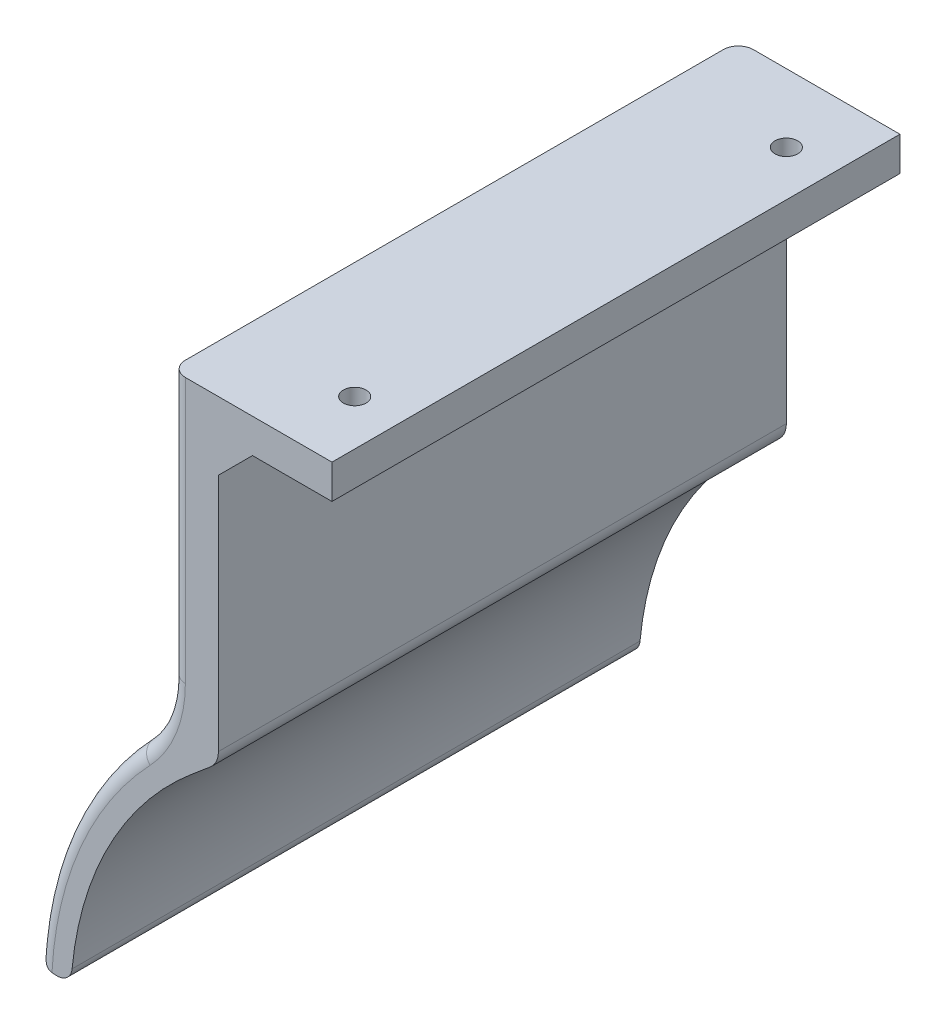
ISO-10303-21;
HEADER;
FILE_DESCRIPTION(('STEP AP214'),'2;1');
FILE_NAME('part.step','',(''),(''),'','','');
FILE_SCHEMA(('AUTOMOTIVE_DESIGN { 1 0 10303 214 1 1 1 1 }'));
ENDSEC;
DATA;
#1=APPLICATION_CONTEXT('core data for automotive mechanical design processes');
#2=APPLICATION_PROTOCOL_DEFINITION('international standard','automotive_design',2000,#1);
#3=PRODUCT_CONTEXT('',#1,'mechanical');
#4=PRODUCT('Part','Part','',(#3));
#5=PRODUCT_RELATED_PRODUCT_CATEGORY('part','',(#4));
#6=PRODUCT_DEFINITION_FORMATION('','',#4);
#7=PRODUCT_DEFINITION_CONTEXT('part definition',#1,'design');
#8=PRODUCT_DEFINITION('design','',#6,#7);
#9=PRODUCT_DEFINITION_SHAPE('','',#8);
#10=(LENGTH_UNIT() NAMED_UNIT(*) SI_UNIT(.MILLI.,.METRE.));
#11=(NAMED_UNIT(*) PLANE_ANGLE_UNIT() SI_UNIT($,.RADIAN.));
#12=(NAMED_UNIT(*) SI_UNIT($,.STERADIAN.) SOLID_ANGLE_UNIT());
#13=UNCERTAINTY_MEASURE_WITH_UNIT(LENGTH_MEASURE(1.E-05),#10,'distance_accuracy_value','');
#14=(GEOMETRIC_REPRESENTATION_CONTEXT(3) GLOBAL_UNCERTAINTY_ASSIGNED_CONTEXT((#13)) GLOBAL_UNIT_ASSIGNED_CONTEXT((#10,
#11,#12)) REPRESENTATION_CONTEXT('',''));
#15=CARTESIAN_POINT('',(0.,0.,0.));
#16=DIRECTION('',(0.,0.,1.));
#17=DIRECTION('',(1.,0.,0.));
#18=AXIS2_PLACEMENT_3D('',#15,#16,#17);
#19=CARTESIAN_POINT('',(-71.3019102651285,49.909696122629,25.));
#20=DIRECTION('',(0.,-1.,0.));
#21=DIRECTION('',(1.,0.,0.));
#22=AXIS2_PLACEMENT_3D('',#19,#20,#21);
#23=PLANE('',#22);
#24=CARTESIAN_POINT('',(-10.9854949612392,49.909696122629,-19.));
#25=DIRECTION('',(0.,-1.,0.));
#26=DIRECTION('',(1.,0.,0.));
#27=AXIS2_PLACEMENT_3D('',#24,#25,#26);
#28=CIRCLE('',#27,1.);
#29=CARTESIAN_POINT('',(-9.98549496123919,49.909696122629,-19.));
#30=VERTEX_POINT('',#29);
#31=EDGE_CURVE('E195',#30,#30,#28,.T.);
#32=ORIENTED_EDGE('',*,*,#31,.F.);
#33=EDGE_LOOP('',(#32));
#34=FACE_BOUND('',#33,.T.);
#35=CARTESIAN_POINT('',(-10.9854949612392,49.909696122629,19.));
#36=DIRECTION('',(0.,-1.,0.));
#37=DIRECTION('',(-1.,0.,0.));
#38=AXIS2_PLACEMENT_3D('',#35,#36,#37);
#39=CIRCLE('',#38,1.);
#40=CARTESIAN_POINT('',(-11.9854949612392,49.909696122629,19.));
#41=VERTEX_POINT('',#40);
#42=EDGE_CURVE('E442',#41,#41,#39,.T.);
#43=ORIENTED_EDGE('',*,*,#42,.F.);
#44=EDGE_LOOP('',(#43));
#45=FACE_BOUND('',#44,.T.);
#46=DIRECTION('',(1.,0.,0.));
#47=VECTOR('',#46,1.);
#48=CARTESIAN_POINT('',(-71.3019102651285,49.909696122629,25.));
#49=LINE('',#48,#47);
#50=CARTESIAN_POINT('',(-13.9854949612392,49.909696122629,25.));
#51=VERTEX_POINT('',#50);
#52=CARTESIAN_POINT('',(-6.98549496123919,49.909696122629,25.));
#53=VERTEX_POINT('',#52);
#54=EDGE_CURVE('E171',#51,#53,#49,.T.);
#55=ORIENTED_EDGE('',*,*,#54,.F.);
#56=DIRECTION('',(0.,0.,-1.));
#57=VECTOR('',#56,1.);
#58=CARTESIAN_POINT('',(-13.9854949612392,49.909696122629,25.));
#59=LINE('',#58,#57);
#60=CARTESIAN_POINT('',(-13.9854949612392,49.909696122629,-25.));
#61=VERTEX_POINT('',#60);
#62=EDGE_CURVE('E71',#51,#61,#59,.T.);
#63=ORIENTED_EDGE('',*,*,#62,.T.);
#64=DIRECTION('',(1.,0.,0.));
#65=VECTOR('',#64,1.);
#66=CARTESIAN_POINT('',(-71.3019102651285,49.909696122629,-25.));
#67=LINE('',#66,#65);
#68=CARTESIAN_POINT('',(-6.98549496123919,49.909696122629,-25.));
#69=VERTEX_POINT('',#68);
#70=EDGE_CURVE('E179',#61,#69,#67,.T.);
#71=ORIENTED_EDGE('',*,*,#70,.T.);
#72=DIRECTION('',(0.,0.,-1.));
#73=VECTOR('',#72,1.);
#74=CARTESIAN_POINT('',(-6.98549496123919,49.909696122629,25.));
#75=LINE('',#74,#73);
#76=EDGE_CURVE('E182',#53,#69,#75,.T.);
#77=ORIENTED_EDGE('',*,*,#76,.F.);
#78=EDGE_LOOP('',(#55,#63,#71,#77));
#79=FACE_BOUND('',#78,.T.);
#80=ADVANCED_FACE('F49',(#34,#45,#79),#23,.T.);
#81=CARTESIAN_POINT('',(-18.9854949612392,25.842311438939,25.));
#82=DIRECTION('',(0.,0.,-1.));
#83=DIRECTION('',(-1.,0.,0.));
#84=AXIS2_PLACEMENT_3D('',#81,#82,#83);
#85=CYLINDRICAL_SURFACE('',#84,2.);
#86=DIRECTION('',(0.,0.,-1.));
#87=VECTOR('',#86,1.);
#88=CARTESIAN_POINT('',(-16.9854949612392,25.842311438939,25.));
#89=LINE('',#88,#87);
#90=CARTESIAN_POINT('',(-16.9854949612392,25.842311438939,25.));
#91=VERTEX_POINT('',#90);
#92=CARTESIAN_POINT('',(-16.9854949612392,25.842311438939,-25.));
#93=VERTEX_POINT('',#92);
#94=EDGE_CURVE('E238',#91,#93,#89,.T.);
#95=ORIENTED_EDGE('',*,*,#94,.F.);
#96=CARTESIAN_POINT('',(-18.9854949612392,25.842311438939,25.));
#97=DIRECTION('',(0.,0.,1.));
#98=DIRECTION('',(1.,0.,0.));
#99=AXIS2_PLACEMENT_3D('',#96,#97,#98);
#100=CIRCLE('',#99,2.);
#101=CARTESIAN_POINT('',(-17.6999197418661,24.310222552701,25.));
#102=VERTEX_POINT('',#101);
#103=EDGE_CURVE('E244',#102,#91,#100,.T.);
#104=ORIENTED_EDGE('',*,*,#103,.F.);
#105=DIRECTION('',(0.,0.,-1.));
#106=VECTOR('',#105,1.);
#107=CARTESIAN_POINT('',(-17.6999197418661,24.310222552701,25.));
#108=LINE('',#107,#106);
#109=CARTESIAN_POINT('',(-17.6999197418661,24.310222552701,-25.));
#110=VERTEX_POINT('',#109);
#111=EDGE_CURVE('E241',#110,#102,#108,.F.);
#112=ORIENTED_EDGE('',*,*,#111,.F.);
#113=CARTESIAN_POINT('',(-18.9854949612392,25.842311438939,-25.));
#114=DIRECTION('',(0.,0.,1.));
#115=DIRECTION('',(1.,0.,0.));
#116=AXIS2_PLACEMENT_3D('',#113,#114,#115);
#117=CIRCLE('',#116,2.);
#118=EDGE_CURVE('E246',#93,#110,#117,.F.);
#119=ORIENTED_EDGE('',*,*,#118,.F.);
#120=EDGE_LOOP('',(#95,#104,#112,#119));
#121=FACE_BOUND('',#120,.T.);
#122=ADVANCED_FACE('F361',(#121),#85,.T.);
#123=CARTESIAN_POINT('',(0.,0.,25.));
#124=DIRECTION('',(0.,0.,-1.));
#125=DIRECTION('',(-1.,0.,0.));
#126=AXIS2_PLACEMENT_3D('',#123,#124,#125);
#127=CYLINDRICAL_SURFACE('',#126,33.);
#128=DIRECTION('',(0.,0.,-1.));
#129=VECTOR('',#128,1.);
#130=CARTESIAN_POINT('',(-23.9533885336893,22.698792429425,25.));
#131=LINE('',#130,#129);
#132=CARTESIAN_POINT('',(-23.9533885336893,22.698792429425,23.68));
#133=VERTEX_POINT('',#132);
#134=CARTESIAN_POINT('',(-23.9533885336893,22.698792429425,-23.68));
#135=VERTEX_POINT('',#134);
#136=EDGE_CURVE('E232',#133,#135,#131,.T.);
#137=ORIENTED_EDGE('',*,*,#136,.T.);
#138=CARTESIAN_POINT('',(0.,0.,-23.68));
#139=DIRECTION('',(0.,0.,1.));
#140=DIRECTION('',(1.,0.,0.));
#141=AXIS2_PLACEMENT_3D('',#138,#139,#140);
#142=CIRCLE('',#141,33.);
#143=CARTESIAN_POINT('',(-32.8541937050148,3.09870230796184,-23.68));
#144=VERTEX_POINT('',#143);
#145=EDGE_CURVE('E266',#135,#144,#142,.T.);
#146=ORIENTED_EDGE('',*,*,#145,.T.);
#147=DIRECTION('',(0.,0.,-1.));
#148=VECTOR('',#147,1.);
#149=CARTESIAN_POINT('',(-32.8541937050148,3.09870230796184,25.));
#150=LINE('',#149,#148);
#151=CARTESIAN_POINT('',(-32.8541937050148,3.09870230796184,23.68));
#152=VERTEX_POINT('',#151);
#153=EDGE_CURVE('E262',#144,#152,#150,.F.);
#154=ORIENTED_EDGE('',*,*,#153,.T.);
#155=CARTESIAN_POINT('',(0.,0.,23.68));
#156=DIRECTION('',(0.,0.,1.));
#157=DIRECTION('',(1.,0.,0.));
#158=AXIS2_PLACEMENT_3D('',#155,#156,#157);
#159=CIRCLE('',#158,33.);
#160=EDGE_CURVE('E264',#152,#133,#159,.F.);
#161=ORIENTED_EDGE('',*,*,#160,.T.);
#162=EDGE_LOOP('',(#137,#146,#154,#161));
#163=FACE_BOUND('',#162,.T.);
#164=ADVANCED_FACE('F369',(#163),#127,.T.);
#165=CARTESIAN_POINT('',(0.,0.,25.));
#166=DIRECTION('',(0.,0.,-1.));
#167=DIRECTION('',(-1.,0.,0.));
#168=AXIS2_PLACEMENT_3D('',#165,#166,#167);
#169=CYLINDRICAL_SURFACE('',#168,30.);
#170=CARTESIAN_POINT('',(0.,0.,25.));
#171=DIRECTION('',(0.,0.,1.));
#172=DIRECTION('',(1.,0.,0.));
#173=AXIS2_PLACEMENT_3D('',#170,#171,#172);
#174=CIRCLE('',#173,30.);
#175=CARTESIAN_POINT('',(-29.8660950662603,2.83131868448316,25.));
#176=VERTEX_POINT('',#175);
#177=CARTESIAN_POINT('',(-19.2836282905961,22.9813332935694,25.));
#178=VERTEX_POINT('',#177);
#179=EDGE_CURVE('E220',#176,#178,#174,.F.);
#180=ORIENTED_EDGE('',*,*,#179,.F.);
#181=DIRECTION('',(0.,0.,-1.));
#182=VECTOR('',#181,1.);
#183=CARTESIAN_POINT('',(-29.8660950662603,2.83131868448316,25.));
#184=LINE('',#183,#182);
#185=CARTESIAN_POINT('',(-29.8660950662603,2.83131868448316,-25.));
#186=VERTEX_POINT('',#185);
#187=EDGE_CURVE('E282',#176,#186,#184,.T.);
#188=ORIENTED_EDGE('',*,*,#187,.T.);
#189=CARTESIAN_POINT('',(0.,0.,-25.));
#190=DIRECTION('',(0.,0.,1.));
#191=DIRECTION('',(1.,0.,0.));
#192=AXIS2_PLACEMENT_3D('',#189,#190,#191);
#193=CIRCLE('',#192,30.);
#194=CARTESIAN_POINT('',(-19.2836282905961,22.9813332935694,-25.));
#195=VERTEX_POINT('',#194);
#196=EDGE_CURVE('E217',#186,#195,#193,.F.);
#197=ORIENTED_EDGE('',*,*,#196,.T.);
#198=DIRECTION('',(0.,0.,-1.));
#199=VECTOR('',#198,1.);
#200=CARTESIAN_POINT('',(-19.2836282905961,22.9813332935694,25.));
#201=LINE('',#200,#199);
#202=EDGE_CURVE('E226',#178,#195,#201,.T.);
#203=ORIENTED_EDGE('',*,*,#202,.F.);
#204=EDGE_LOOP('',(#180,#188,#197,#203));
#205=FACE_BOUND('',#204,.T.);
#206=ADVANCED_FACE('F400',(#205),#169,.F.);
#207=CARTESIAN_POINT('',(-19.2836282905961,22.9813332935694,25.));
#208=DIRECTION('',(-0.642787609686538,0.766044443118979,0.));
#209=DIRECTION('',(-0.766044443118979,-0.642787609686538,0.));
#210=AXIS2_PLACEMENT_3D('',#207,#208,#209);
#211=PLANE('',#210);
#212=DIRECTION('',(0.766044443118979,0.642787609686538,0.));
#213=VECTOR('',#212,1.);
#214=CARTESIAN_POINT('',(-19.2836282905961,22.9813332935694,-25.));
#215=LINE('',#214,#213);
#216=EDGE_CURVE('E223',#195,#110,#215,.T.);
#217=ORIENTED_EDGE('',*,*,#216,.T.);
#218=ORIENTED_EDGE('',*,*,#111,.T.);
#219=DIRECTION('',(0.766044443118979,0.642787609686538,0.));
#220=VECTOR('',#219,1.);
#221=CARTESIAN_POINT('',(-19.2836282905961,22.9813332935694,25.));
#222=LINE('',#221,#220);
#223=EDGE_CURVE('E222',#178,#102,#222,.T.);
#224=ORIENTED_EDGE('',*,*,#223,.F.);
#225=ORIENTED_EDGE('',*,*,#202,.T.);
#226=EDGE_LOOP('',(#217,#218,#224,#225));
#227=FACE_BOUND('',#226,.T.);
#228=ADVANCED_FACE('F394',(#227),#211,.F.);
#229=CARTESIAN_POINT('',(0.,0.,25.));
#230=DIRECTION('',(0.,0.,1.));
#231=DIRECTION('',(1.,0.,0.));
#232=AXIS2_PLACEMENT_3D('',#229,#230,#231);
#233=PLANE('',#232);
#234=DIRECTION('',(-0.998629534754574,0.0523359562429438,0.));
#235=VECTOR('',#234,1.);
#236=CARTESIAN_POINT('',(-32.9547746469009,1.72708655601714,25.));
#237=LINE('',#236,#235);
#238=CARTESIAN_POINT('',(-31.2492867114164,1.63770572072438,25.));
#239=VERTEX_POINT('',#238);
#240=CARTESIAN_POINT('',(-31.6091094190549,1.65656322976732,25.));
#241=VERTEX_POINT('',#240);
#242=EDGE_CURVE('E210',#239,#241,#237,.T.);
#243=ORIENTED_EDGE('',*,*,#242,.F.);
#244=CARTESIAN_POINT('',(-31.1802032491757,2.95589670660042,25.));
#245=DIRECTION('',(0.,0.,1.));
#246=DIRECTION('',(1.,0.,0.));
#247=AXIS2_PLACEMENT_3D('',#244,#245,#246);
#248=CIRCLE('',#247,1.32);
#249=EDGE_CURVE('E280',#239,#176,#248,.T.);
#250=ORIENTED_EDGE('',*,*,#249,.T.);
#251=ORIENTED_EDGE('',*,*,#179,.T.);
#252=ORIENTED_EDGE('',*,*,#223,.T.);
#253=ORIENTED_EDGE('',*,*,#103,.T.);
#254=DIRECTION('',(0.,1.,0.));
#255=VECTOR('',#254,1.);
#256=CARTESIAN_POINT('',(-16.9854949612392,0.,25.));
#257=LINE('',#256,#255);
#258=CARTESIAN_POINT('',(-16.9854949612392,46.909696122629,25.));
#259=VERTEX_POINT('',#258);
#260=EDGE_CURVE('E215',#91,#259,#257,.T.);
#261=ORIENTED_EDGE('',*,*,#260,.T.);
#262=DIRECTION('',(0.707106781186544,0.707106781186551,0.));
#263=VECTOR('',#262,1.);
#264=CARTESIAN_POINT('',(-16.9854949612392,46.909696122629,25.));
#265=LINE('',#264,#263);
#266=EDGE_CURVE('E58',#259,#51,#265,.T.);
#267=ORIENTED_EDGE('',*,*,#266,.T.);
#268=ORIENTED_EDGE('',*,*,#54,.T.);
#269=DIRECTION('',(0.,-1.,0.));
#270=VECTOR('',#269,1.);
#271=CARTESIAN_POINT('',(-6.98549496123919,52.909696122629,25.));
#272=LINE('',#271,#270);
#273=CARTESIAN_POINT('',(-6.98549496123919,52.909696122629,25.));
#274=VERTEX_POINT('',#273);
#275=EDGE_CURVE('E177',#274,#53,#272,.T.);
#276=ORIENTED_EDGE('',*,*,#275,.F.);
#277=DIRECTION('',(1.,0.,0.));
#278=VECTOR('',#277,1.);
#279=CARTESIAN_POINT('',(-21.2119911196558,52.909696122629,25.));
#280=LINE('',#279,#278);
#281=CARTESIAN_POINT('',(-19.8919911196558,52.909696122629,25.));
#282=VERTEX_POINT('',#281);
#283=EDGE_CURVE('E178',#282,#274,#280,.T.);
#284=ORIENTED_EDGE('',*,*,#283,.F.);
#285=DIRECTION('',(0.,1.,0.));
#286=VECTOR('',#285,1.);
#287=CARTESIAN_POINT('',(-19.8919911196558,0.,25.));
#288=LINE('',#287,#286);
#289=CARTESIAN_POINT('',(-19.8919911196558,29.5772143777356,25.));
#290=VERTEX_POINT('',#289);
#291=EDGE_CURVE('E272',#282,#290,#288,.F.);
#292=ORIENTED_EDGE('',*,*,#291,.T.);
#293=CARTESIAN_POINT('',(-31.2119911196558,29.5772143777356,25.));
#294=DIRECTION('',(0.,0.,1.));
#295=DIRECTION('',(1.,0.,0.));
#296=AXIS2_PLACEMENT_3D('',#293,#294,#295);
#297=CIRCLE('',#296,11.32);
#298=CARTESIAN_POINT('',(-22.9952529923417,21.790840732248,25.));
#299=VERTEX_POINT('',#298);
#300=EDGE_CURVE('E274',#290,#299,#297,.F.);
#301=ORIENTED_EDGE('',*,*,#300,.T.);
#302=CARTESIAN_POINT('',(0.,0.,25.));
#303=DIRECTION('',(0.,0.,1.));
#304=DIRECTION('',(1.,0.,0.));
#305=AXIS2_PLACEMENT_3D('',#302,#303,#304);
#306=CIRCLE('',#305,31.68);
#307=CARTESIAN_POINT('',(-31.6365686530016,1.65828943912526,25.));
#308=VERTEX_POINT('',#307);
#309=EDGE_CURVE('E276',#299,#308,#306,.T.);
#310=ORIENTED_EDGE('',*,*,#309,.T.);
#311=CARTESIAN_POINT('',(-31.5400259568142,2.97475421564336,25.));
#312=DIRECTION('',(0.,0.,1.));
#313=DIRECTION('',(1.,0.,0.));
#314=AXIS2_PLACEMENT_3D('',#311,#312,#313);
#315=CIRCLE('',#314,1.32);
#316=EDGE_CURVE('E278',#308,#241,#315,.T.);
#317=ORIENTED_EDGE('',*,*,#316,.T.);
#318=EDGE_LOOP('',(#243,#250,#251,#252,#253,#261,#267,#268,#276,#284,#292,#301,#310,#317));
#319=FACE_BOUND('',#318,.T.);
#320=ADVANCED_FACE('F174',(#319),#233,.T.);
#321=CARTESIAN_POINT('',(0.,0.,-25.));
#322=DIRECTION('',(0.,0.,1.));
#323=DIRECTION('',(1.,0.,0.));
#324=AXIS2_PLACEMENT_3D('',#321,#322,#323);
#325=PLANE('',#324);
#326=ORIENTED_EDGE('',*,*,#196,.F.);
#327=CARTESIAN_POINT('',(-31.1802032491757,2.95589670660042,-25.));
#328=DIRECTION('',(0.,0.,1.));
#329=DIRECTION('',(1.,0.,0.));
#330=AXIS2_PLACEMENT_3D('',#327,#328,#329);
#331=CIRCLE('',#330,1.32);
#332=CARTESIAN_POINT('',(-31.2492867114164,1.63770572072438,-25.));
#333=VERTEX_POINT('',#332);
#334=EDGE_CURVE('E260',#186,#333,#331,.F.);
#335=ORIENTED_EDGE('',*,*,#334,.T.);
#336=DIRECTION('',(-0.998629534754574,0.0523359562429438,0.));
#337=VECTOR('',#336,1.);
#338=CARTESIAN_POINT('',(0.,0.,-25.));
#339=LINE('',#338,#337);
#340=CARTESIAN_POINT('',(-31.6091094190549,1.65656322976732,-25.));
#341=VERTEX_POINT('',#340);
#342=EDGE_CURVE('E248',#333,#341,#339,.T.);
#343=ORIENTED_EDGE('',*,*,#342,.T.);
#344=CARTESIAN_POINT('',(-31.5400259568142,2.97475421564336,-25.));
#345=DIRECTION('',(0.,0.,1.));
#346=DIRECTION('',(1.,0.,0.));
#347=AXIS2_PLACEMENT_3D('',#344,#345,#346);
#348=CIRCLE('',#347,1.32);
#349=CARTESIAN_POINT('',(-31.6365686530016,1.65828943912526,-25.));
#350=VERTEX_POINT('',#349);
#351=EDGE_CURVE('E258',#341,#350,#348,.F.);
#352=ORIENTED_EDGE('',*,*,#351,.T.);
#353=CARTESIAN_POINT('',(0.,0.,-25.));
#354=DIRECTION('',(0.,0.,1.));
#355=DIRECTION('',(1.,0.,0.));
#356=AXIS2_PLACEMENT_3D('',#353,#354,#355);
#357=CIRCLE('',#356,31.68);
#358=CARTESIAN_POINT('',(-22.9952529923417,21.790840732248,-25.));
#359=VERTEX_POINT('',#358);
#360=EDGE_CURVE('E255',#350,#359,#357,.F.);
#361=ORIENTED_EDGE('',*,*,#360,.T.);
#362=CARTESIAN_POINT('',(-31.2119911196558,29.5772143777356,-25.));
#363=DIRECTION('',(0.,0.,1.));
#364=DIRECTION('',(1.,0.,0.));
#365=AXIS2_PLACEMENT_3D('',#362,#363,#364);
#366=CIRCLE('',#365,11.32);
#367=CARTESIAN_POINT('',(-19.8919911196558,29.5772143777356,-25.));
#368=VERTEX_POINT('',#367);
#369=EDGE_CURVE('E253',#359,#368,#366,.T.);
#370=ORIENTED_EDGE('',*,*,#369,.T.);
#371=DIRECTION('',(0.,1.,0.));
#372=VECTOR('',#371,1.);
#373=CARTESIAN_POINT('',(-19.8919911196558,52.909696122629,-25.));
#374=LINE('',#373,#372);
#375=CARTESIAN_POINT('',(-19.8919911196558,52.909696122629,-25.));
#376=VERTEX_POINT('',#375);
#377=EDGE_CURVE('E251',#368,#376,#374,.T.);
#378=ORIENTED_EDGE('',*,*,#377,.T.);
#379=DIRECTION('',(-1.,0.,0.));
#380=VECTOR('',#379,1.);
#381=CARTESIAN_POINT('',(-21.2119911196558,52.909696122629,-25.));
#382=LINE('',#381,#380);
#383=CARTESIAN_POINT('',(-6.98549496123919,52.909696122629,-25.));
#384=VERTEX_POINT('',#383);
#385=EDGE_CURVE('E207',#384,#376,#382,.T.);
#386=ORIENTED_EDGE('',*,*,#385,.F.);
#387=DIRECTION('',(0.,1.,0.));
#388=VECTOR('',#387,1.);
#389=CARTESIAN_POINT('',(-6.98549496123919,52.909696122629,-25.));
#390=LINE('',#389,#388);
#391=EDGE_CURVE('E186',#69,#384,#390,.T.);
#392=ORIENTED_EDGE('',*,*,#391,.F.);
#393=ORIENTED_EDGE('',*,*,#70,.F.);
#394=DIRECTION('',(-0.707106781186544,-0.707106781186551,0.));
#395=VECTOR('',#394,1.);
#396=CARTESIAN_POINT('',(-31.9475955419342,31.9475955419339,-25.));
#397=LINE('',#396,#395);
#398=CARTESIAN_POINT('',(-16.9854949612392,46.909696122629,-25.));
#399=VERTEX_POINT('',#398);
#400=EDGE_CURVE('E11',#61,#399,#397,.T.);
#401=ORIENTED_EDGE('',*,*,#400,.T.);
#402=DIRECTION('',(0.,1.,0.));
#403=VECTOR('',#402,1.);
#404=CARTESIAN_POINT('',(-16.9854949612392,0.,-25.));
#405=LINE('',#404,#403);
#406=EDGE_CURVE('E214',#93,#399,#405,.T.);
#407=ORIENTED_EDGE('',*,*,#406,.F.);
#408=ORIENTED_EDGE('',*,*,#118,.T.);
#409=ORIENTED_EDGE('',*,*,#216,.F.);
#410=EDGE_LOOP('',(#326,#335,#343,#352,#361,#370,#378,#386,#392,#393,#401,#407,#408,#409));
#411=FACE_BOUND('',#410,.T.);
#412=ADVANCED_FACE('F391',(#411),#325,.F.);
#413=CARTESIAN_POINT('',(-21.2119911196558,0.,25.));
#414=DIRECTION('',(-1.,0.,0.));
#415=DIRECTION('',(0.,-1.,0.));
#416=AXIS2_PLACEMENT_3D('',#413,#414,#415);
#417=PLANE('',#416);
#418=DIRECTION('',(0.,1.,0.));
#419=VECTOR('',#418,1.);
#420=CARTESIAN_POINT('',(-21.2119911196558,29.5772143777356,-23.68));
#421=LINE('',#420,#419);
#422=CARTESIAN_POINT('',(-21.2119911196558,52.909696122629,-23.68));
#423=VERTEX_POINT('',#422);
#424=CARTESIAN_POINT('',(-21.2119911196558,29.5772143777356,-23.68));
#425=VERTEX_POINT('',#424);
#426=EDGE_CURVE('E295',#423,#425,#421,.F.);
#427=ORIENTED_EDGE('',*,*,#426,.T.);
#428=DIRECTION('',(0.,0.,1.));
#429=VECTOR('',#428,1.);
#430=CARTESIAN_POINT('',(-21.2119911196558,29.5772143777356,25.));
#431=LINE('',#430,#429);
#432=CARTESIAN_POINT('',(-21.2119911196558,29.5772143777356,23.68));
#433=VERTEX_POINT('',#432);
#434=EDGE_CURVE('E235',#425,#433,#431,.T.);
#435=ORIENTED_EDGE('',*,*,#434,.T.);
#436=DIRECTION('',(0.,1.,0.));
#437=VECTOR('',#436,1.);
#438=CARTESIAN_POINT('',(-21.2119911196558,0.,23.68));
#439=LINE('',#438,#437);
#440=CARTESIAN_POINT('',(-21.2119911196558,52.909696122629,23.68));
#441=VERTEX_POINT('',#440);
#442=EDGE_CURVE('E293',#433,#441,#439,.T.);
#443=ORIENTED_EDGE('',*,*,#442,.T.);
#444=DIRECTION('',(0.,0.,1.));
#445=VECTOR('',#444,1.);
#446=CARTESIAN_POINT('',(-21.2119911196558,52.909696122629,-25.));
#447=LINE('',#446,#445);
#448=EDGE_CURVE('E204',#423,#441,#447,.T.);
#449=ORIENTED_EDGE('',*,*,#448,.F.);
#450=EDGE_LOOP('',(#427,#435,#443,#449));
#451=FACE_BOUND('',#450,.T.);
#452=ADVANCED_FACE('F388',(#451),#417,.T.);
#453=CARTESIAN_POINT('',(-16.9854949612392,0.,25.));
#454=DIRECTION('',(-1.,0.,0.));
#455=DIRECTION('',(0.,-1.,0.));
#456=AXIS2_PLACEMENT_3D('',#453,#454,#455);
#457=PLANE('',#456);
#458=ORIENTED_EDGE('',*,*,#406,.T.);
#459=DIRECTION('',(0.,0.,1.));
#460=VECTOR('',#459,1.);
#461=CARTESIAN_POINT('',(-16.9854949612392,46.909696122629,25.));
#462=LINE('',#461,#460);
#463=EDGE_CURVE('E298',#399,#259,#462,.T.);
#464=ORIENTED_EDGE('',*,*,#463,.T.);
#465=ORIENTED_EDGE('',*,*,#260,.F.);
#466=ORIENTED_EDGE('',*,*,#94,.T.);
#467=EDGE_LOOP('',(#458,#464,#465,#466));
#468=FACE_BOUND('',#467,.T.);
#469=ADVANCED_FACE('F385',(#468),#457,.F.);
#470=CARTESIAN_POINT('',(-31.2119911196558,29.5772143777356,25.));
#471=DIRECTION('',(0.,0.,-1.));
#472=DIRECTION('',(-1.,0.,0.));
#473=AXIS2_PLACEMENT_3D('',#470,#471,#472);
#474=CYLINDRICAL_SURFACE('',#473,10.);
#475=ORIENTED_EDGE('',*,*,#434,.F.);
#476=CARTESIAN_POINT('',(-31.2119911196558,29.5772143777356,-23.68));
#477=DIRECTION('',(0.,0.,1.));
#478=DIRECTION('',(1.,0.,0.));
#479=AXIS2_PLACEMENT_3D('',#476,#477,#478);
#480=CIRCLE('',#479,10.);
#481=EDGE_CURVE('E270',#425,#135,#480,.F.);
#482=ORIENTED_EDGE('',*,*,#481,.T.);
#483=ORIENTED_EDGE('',*,*,#136,.F.);
#484=CARTESIAN_POINT('',(-31.2119911196558,29.5772143777356,23.68));
#485=DIRECTION('',(0.,0.,1.));
#486=DIRECTION('',(1.,0.,0.));
#487=AXIS2_PLACEMENT_3D('',#484,#485,#486);
#488=CIRCLE('',#487,10.);
#489=EDGE_CURVE('E268',#133,#433,#488,.T.);
#490=ORIENTED_EDGE('',*,*,#489,.T.);
#491=EDGE_LOOP('',(#475,#482,#483,#490));
#492=FACE_BOUND('',#491,.T.);
#493=ADVANCED_FACE('F383',(#492),#474,.F.);
#494=CARTESIAN_POINT('',(-32.9547746469009,1.72708655601714,-25.));
#495=DIRECTION('',(0.0523359562429438,0.998629534754574,0.));
#496=DIRECTION('',(-0.998629534754574,0.0523359562429438,0.));
#497=AXIS2_PLACEMENT_3D('',#494,#495,#496);
#498=PLANE('',#497);
#499=ORIENTED_EDGE('',*,*,#342,.F.);
#500=DIRECTION('',(0.,0.,-1.));
#501=VECTOR('',#500,1.);
#502=CARTESIAN_POINT('',(-31.2492867114164,1.63770572072438,-25.));
#503=LINE('',#502,#501);
#504=EDGE_CURVE('E287',#333,#239,#503,.F.);
#505=ORIENTED_EDGE('',*,*,#504,.T.);
#506=ORIENTED_EDGE('',*,*,#242,.T.);
#507=DIRECTION('',(0.,0.,1.));
#508=VECTOR('',#507,1.);
#509=CARTESIAN_POINT('',(-31.6091094190549,1.65656322976732,-25.));
#510=LINE('',#509,#508);
#511=EDGE_CURVE('E285',#241,#341,#510,.F.);
#512=ORIENTED_EDGE('',*,*,#511,.T.);
#513=EDGE_LOOP('',(#499,#505,#506,#512));
#514=FACE_BOUND('',#513,.T.);
#515=ADVANCED_FACE('F379',(#514),#498,.F.);
#516=CARTESIAN_POINT('',(0.,52.909696122629,0.));
#517=DIRECTION('',(0.,1.,0.));
#518=DIRECTION('',(0.,0.,1.));
#519=AXIS2_PLACEMENT_3D('',#516,#517,#518);
#520=PLANE('',#519);
#521=CARTESIAN_POINT('',(-10.9854949612392,52.909696122629,-19.));
#522=DIRECTION('',(0.,-1.,0.));
#523=DIRECTION('',(1.,0.,0.));
#524=AXIS2_PLACEMENT_3D('',#521,#522,#523);
#525=CIRCLE('',#524,1.);
#526=CARTESIAN_POINT('',(-9.98549496123919,52.909696122629,-19.));
#527=VERTEX_POINT('',#526);
#528=EDGE_CURVE('E192',#527,#527,#525,.T.);
#529=ORIENTED_EDGE('',*,*,#528,.T.);
#530=EDGE_LOOP('',(#529));
#531=FACE_BOUND('',#530,.T.);
#532=CARTESIAN_POINT('',(-10.9854949612392,52.909696122629,19.));
#533=DIRECTION('',(0.,-1.,0.));
#534=DIRECTION('',(-1.,0.,0.));
#535=AXIS2_PLACEMENT_3D('',#532,#533,#534);
#536=CIRCLE('',#535,1.);
#537=CARTESIAN_POINT('',(-11.9854949612392,52.909696122629,19.));
#538=VERTEX_POINT('',#537);
#539=EDGE_CURVE('E198',#538,#538,#536,.T.);
#540=ORIENTED_EDGE('',*,*,#539,.T.);
#541=EDGE_LOOP('',(#540));
#542=FACE_BOUND('',#541,.T.);
#543=ORIENTED_EDGE('',*,*,#385,.T.);
#544=CARTESIAN_POINT('',(-19.8919911196558,52.909696122629,-23.68));
#545=DIRECTION('',(0.,1.,0.));
#546=DIRECTION('',(0.,0.,1.));
#547=AXIS2_PLACEMENT_3D('',#544,#545,#546);
#548=CIRCLE('',#547,1.32);
#549=EDGE_CURVE('E291',#376,#423,#548,.T.);
#550=ORIENTED_EDGE('',*,*,#549,.T.);
#551=ORIENTED_EDGE('',*,*,#448,.T.);
#552=CARTESIAN_POINT('',(-19.8919911196558,52.909696122629,23.68));
#553=DIRECTION('',(0.,1.,0.));
#554=DIRECTION('',(0.,0.,1.));
#555=AXIS2_PLACEMENT_3D('',#552,#553,#554);
#556=CIRCLE('',#555,1.32);
#557=EDGE_CURVE('E289',#441,#282,#556,.T.);
#558=ORIENTED_EDGE('',*,*,#557,.T.);
#559=ORIENTED_EDGE('',*,*,#283,.T.);
#560=DIRECTION('',(0.,0.,1.));
#561=VECTOR('',#560,1.);
#562=CARTESIAN_POINT('',(-6.98549496123919,52.909696122629,25.));
#563=LINE('',#562,#561);
#564=EDGE_CURVE('E191',#384,#274,#563,.T.);
#565=ORIENTED_EDGE('',*,*,#564,.F.);
#566=EDGE_LOOP('',(#543,#550,#551,#558,#559,#565));
#567=FACE_BOUND('',#566,.T.);
#568=ADVANCED_FACE('F376',(#531,#542,#567),#520,.T.);
#569=CARTESIAN_POINT('',(-6.98549496123919,0.,0.));
#570=DIRECTION('',(1.,0.,0.));
#571=DIRECTION('',(0.,0.,-1.));
#572=AXIS2_PLACEMENT_3D('',#569,#570,#571);
#573=PLANE('',#572);
#574=ORIENTED_EDGE('',*,*,#275,.T.);
#575=ORIENTED_EDGE('',*,*,#76,.T.);
#576=ORIENTED_EDGE('',*,*,#391,.T.);
#577=ORIENTED_EDGE('',*,*,#564,.T.);
#578=EDGE_LOOP('',(#574,#575,#576,#577));
#579=FACE_BOUND('',#578,.T.);
#580=ADVANCED_FACE('F189',(#579),#573,.T.);
#581=CARTESIAN_POINT('',(-10.9854949612392,52.909696122629,19.));
#582=DIRECTION('',(0.,-1.,0.));
#583=DIRECTION('',(1.,0.,0.));
#584=AXIS2_PLACEMENT_3D('',#581,#582,#583);
#585=CYLINDRICAL_SURFACE('',#584,1.);
#586=ORIENTED_EDGE('',*,*,#539,.F.);
#587=EDGE_LOOP('',(#586));
#588=FACE_BOUND('',#587,.T.);
#589=ORIENTED_EDGE('',*,*,#42,.T.);
#590=EDGE_LOOP('',(#589));
#591=FACE_BOUND('',#590,.T.);
#592=ADVANCED_FACE('F471',(#588,#591),#585,.F.);
#593=CARTESIAN_POINT('',(-10.9854949612392,52.909696122629,-19.));
#594=DIRECTION('',(0.,-1.,0.));
#595=DIRECTION('',(1.,0.,0.));
#596=AXIS2_PLACEMENT_3D('',#593,#594,#595);
#597=CYLINDRICAL_SURFACE('',#596,1.);
#598=ORIENTED_EDGE('',*,*,#528,.F.);
#599=EDGE_LOOP('',(#598));
#600=FACE_BOUND('',#599,.T.);
#601=ORIENTED_EDGE('',*,*,#31,.T.);
#602=EDGE_LOOP('',(#601));
#603=FACE_BOUND('',#602,.T.);
#604=ADVANCED_FACE('F347',(#600,#603),#597,.F.);
#605=CARTESIAN_POINT('',(-19.8919911196558,0.,23.68));
#606=DIRECTION('',(0.,1.,0.));
#607=DIRECTION('',(-1.,0.,0.));
#608=AXIS2_PLACEMENT_3D('',#605,#606,#607);
#609=CYLINDRICAL_SURFACE('',#608,1.32);
#610=ORIENTED_EDGE('',*,*,#557,.F.);
#611=ORIENTED_EDGE('',*,*,#442,.F.);
#612=CARTESIAN_POINT('',(-19.8919911196558,29.5772143777356,23.68));
#613=DIRECTION('',(0.,-1.,0.));
#614=DIRECTION('',(0.,0.,-1.));
#615=AXIS2_PLACEMENT_3D('',#612,#613,#614);
#616=CIRCLE('',#615,1.32);
#617=EDGE_CURVE('E439',#290,#433,#616,.T.);
#618=ORIENTED_EDGE('',*,*,#617,.F.);
#619=ORIENTED_EDGE('',*,*,#291,.F.);
#620=EDGE_LOOP('',(#610,#611,#618,#619));
#621=FACE_BOUND('',#620,.T.);
#622=ADVANCED_FACE('F344',(#621),#609,.T.);
#623=CARTESIAN_POINT('',(-31.2119911196558,29.5772143777356,23.68));
#624=DIRECTION('',(0.,0.,1.));
#625=DIRECTION('',(1.,0.,0.));
#626=AXIS2_PLACEMENT_3D('',#623,#624,#625);
#627=TOROIDAL_SURFACE('',#626,11.32,1.32);
#628=ORIENTED_EDGE('',*,*,#617,.T.);
#629=ORIENTED_EDGE('',*,*,#489,.F.);
#630=CARTESIAN_POINT('',(-22.9952529923417,21.790840732248,23.68));
#631=DIRECTION('',(-0.687842194831061,-0.725860258596646,0.));
#632=DIRECTION('',(0.725860258596646,-0.687842194831061,0.));
#633=AXIS2_PLACEMENT_3D('',#630,#631,#632);
#634=CIRCLE('',#633,1.32);
#635=EDGE_CURVE('E331',#299,#133,#634,.T.);
#636=ORIENTED_EDGE('',*,*,#635,.F.);
#637=ORIENTED_EDGE('',*,*,#300,.F.);
#638=EDGE_LOOP('',(#628,#629,#636,#637));
#639=FACE_BOUND('',#638,.T.);
#640=ADVANCED_FACE('F337',(#639),#627,.T.);
#641=CARTESIAN_POINT('',(0.,0.,23.68));
#642=DIRECTION('',(0.,0.,1.));
#643=DIRECTION('',(1.,0.,0.));
#644=AXIS2_PLACEMENT_3D('',#641,#642,#643);
#645=TOROIDAL_SURFACE('',#644,31.68,1.32);
#646=ORIENTED_EDGE('',*,*,#635,.T.);
#647=ORIENTED_EDGE('',*,*,#160,.F.);
#648=CARTESIAN_POINT('',(-31.6365686530016,1.65828943912526,25.));
#649=CARTESIAN_POINT('',(-31.6662399063709,1.66046131251422,25.0000040134727));
#650=CARTESIAN_POINT('',(-31.6958180556444,1.66364384415649,24.9989937967154));
#651=CARTESIAN_POINT('',(-31.7545391375412,1.6719644354334,24.9950003834396));
#652=CARTESIAN_POINT('',(-31.7836824075432,1.67710088742087,24.992018807432));
#653=CARTESIAN_POINT('',(-31.8696165698644,1.69523581516523,24.9802718681289));
#654=CARTESIAN_POINT('',(-31.9254791357579,1.71100349267569,24.9687019716475));
#655=CARTESIAN_POINT('',(-32.0328727018548,1.74888866221599,24.9390265215741));
#656=CARTESIAN_POINT('',(-32.0844158315581,1.77098754647149,24.9209400809182));
#657=CARTESIAN_POINT('',(-32.1826516727183,1.820429704677,24.8793200522406));
#658=CARTESIAN_POINT('',(-32.229332873046,1.84778500720008,24.8557739444894));
#659=CARTESIAN_POINT('',(-32.3353065007479,1.91859158599917,24.7938560935078));
#660=CARTESIAN_POINT('',(-32.3920001950797,1.96406283473375,24.7533505021086));
#661=CARTESIAN_POINT('',(-32.494893911071,2.06062837014193,24.6662227803899));
#662=CARTESIAN_POINT('',(-32.5410746195915,2.11173275382633,24.6195896371551));
#663=CARTESIAN_POINT('',(-32.6386193799457,2.23723999885324,24.5040624982545));
#664=CARTESIAN_POINT('',(-32.6856306089076,2.31329279949785,24.4332944019447));
#665=CARTESIAN_POINT('',(-32.7624882053847,2.46922840660168,24.2869016088762));
#666=CARTESIAN_POINT('',(-32.7923129154075,2.54911590868094,24.211270917298));
#667=CARTESIAN_POINT('',(-32.8349558153332,2.70663265902939,24.0609673232537));
#668=CARTESIAN_POINT('',(-32.8485192425626,2.78418714283523,23.98642165102));
#669=CARTESIAN_POINT('',(-32.8618314128771,2.93920498975673,23.8362886447487));
#670=CARTESIAN_POINT('',(-32.8616097114007,3.0166681917534,23.7607038866121));
#671=CARTESIAN_POINT('',(-32.8545217806954,3.09518609584162,23.6834601320878));
#672=CARTESIAN_POINT('',(-32.8543595023644,3.09694439112728,23.681730043346));
#673=CARTESIAN_POINT('',(-32.8541937050148,3.09870230796184,23.68));
#674=B_SPLINE_CURVE_WITH_KNOTS('',3,(#648,#649,#650,#651,#652,#653,#654,#655,#656,#657,#658,
#659,#660,#661,#662,#663,#664,#665,#666,#667,#668,#669,#670,#671,#672,#673),.UNSPECIFIED.,.F.,
.F.,(4,2,2,2,2,2,2,2,2,2,2,2,4),(0.,0.0891820807338986,0.178290942363286,0.354828562621456,
0.530852560030631,0.707284266734352,0.955515395476963,1.20419892805357,1.54445251654586,
1.88513394124472,2.2095194728016,2.53320954292715,2.54062574903151),.UNSPECIFIED.);
#675=EDGE_CURVE('E324',#308,#152,#674,.T.);
#676=ORIENTED_EDGE('',*,*,#675,.F.);
#677=ORIENTED_EDGE('',*,*,#309,.F.);
#678=EDGE_LOOP('',(#646,#647,#676,#677));
#679=FACE_BOUND('',#678,.T.);
#680=ADVANCED_FACE('F333',(#679),#645,.T.);
#681=CARTESIAN_POINT('',(-19.8919911196558,0.,-23.68));
#682=DIRECTION('',(0.,-1.,0.));
#683=DIRECTION('',(1.,0.,0.));
#684=AXIS2_PLACEMENT_3D('',#681,#682,#683);
#685=CYLINDRICAL_SURFACE('',#684,1.32);
#686=ORIENTED_EDGE('',*,*,#549,.F.);
#687=ORIENTED_EDGE('',*,*,#377,.F.);
#688=CARTESIAN_POINT('',(-19.8919911196558,29.5772143777356,-23.68));
#689=DIRECTION('',(0.,-1.,0.));
#690=DIRECTION('',(0.,0.,-1.));
#691=AXIS2_PLACEMENT_3D('',#688,#689,#690);
#692=CIRCLE('',#691,1.32);
#693=EDGE_CURVE('E310',#425,#368,#692,.T.);
#694=ORIENTED_EDGE('',*,*,#693,.F.);
#695=ORIENTED_EDGE('',*,*,#426,.F.);
#696=EDGE_LOOP('',(#686,#687,#694,#695));
#697=FACE_BOUND('',#696,.T.);
#698=ADVANCED_FACE('F320',(#697),#685,.T.);
#699=CARTESIAN_POINT('',(-31.5400259568142,2.97475421564336,25.));
#700=DIRECTION('',(0.,0.,-1.));
#701=DIRECTION('',(-1.,0.,0.));
#702=AXIS2_PLACEMENT_3D('',#699,#700,#701);
#703=CYLINDRICAL_SURFACE('',#702,1.32);
#704=ORIENTED_EDGE('',*,*,#675,.T.);
#705=ORIENTED_EDGE('',*,*,#153,.F.);
#706=CARTESIAN_POINT('',(-31.6365686530016,1.65828943912526,-25.));
#707=CARTESIAN_POINT('',(-31.6662399063709,1.66046131251422,-25.0000040134727));
#708=CARTESIAN_POINT('',(-31.6958180556444,1.66364384415649,-24.9989937967154));
#709=CARTESIAN_POINT('',(-31.7545391375412,1.6719644354334,-24.9950003834396));
#710=CARTESIAN_POINT('',(-31.7836824075432,1.67710088742087,-24.992018807432));
#711=CARTESIAN_POINT('',(-31.8696165698644,1.69523581516523,-24.9802718681289));
#712=CARTESIAN_POINT('',(-31.9254791357579,1.71100349267569,-24.9687019716475));
#713=CARTESIAN_POINT('',(-32.0328727018548,1.74888866221599,-24.9390265215741));
#714=CARTESIAN_POINT('',(-32.0844158315581,1.77098754647149,-24.9209400809182));
#715=CARTESIAN_POINT('',(-32.1826516727183,1.820429704677,-24.8793200522406));
#716=CARTESIAN_POINT('',(-32.229332873046,1.84778500720008,-24.8557739444894));
#717=CARTESIAN_POINT('',(-32.3353065007479,1.91859158599917,-24.7938560935078));
#718=CARTESIAN_POINT('',(-32.3920001950797,1.96406283473375,-24.7533505021086));
#719=CARTESIAN_POINT('',(-32.494893911071,2.06062837014193,-24.6662227803899));
#720=CARTESIAN_POINT('',(-32.5410746195915,2.11173275382633,-24.6195896371551));
#721=CARTESIAN_POINT('',(-32.6386193799457,2.23723999885324,-24.5040624982545));
#722=CARTESIAN_POINT('',(-32.6856306089076,2.31329279949785,-24.4332944019447));
#723=CARTESIAN_POINT('',(-32.7624882053847,2.46922840660168,-24.2869016088762));
#724=CARTESIAN_POINT('',(-32.7923129154075,2.54911590868094,-24.211270917298));
#725=CARTESIAN_POINT('',(-32.8349558153332,2.70663265902939,-24.0609673232537));
#726=CARTESIAN_POINT('',(-32.8485192425626,2.78418714283523,-23.98642165102));
#727=CARTESIAN_POINT('',(-32.8618314128771,2.93920498975673,-23.8362886447487));
#728=CARTESIAN_POINT('',(-32.8616097114007,3.0166681917534,-23.7607038866121));
#729=CARTESIAN_POINT('',(-32.8545217806954,3.09518609584162,-23.6834601320878));
#730=CARTESIAN_POINT('',(-32.8543595023644,3.09694439112728,-23.681730043346));
#731=CARTESIAN_POINT('',(-32.8541937050148,3.09870230796184,-23.68));
#732=B_SPLINE_CURVE_WITH_KNOTS('',3,(#706,#707,#708,#709,#710,#711,#712,#713,#714,#715,#716,
#717,#718,#719,#720,#721,#722,#723,#724,#725,#726,#727,#728,#729,#730,#731),.UNSPECIFIED.,.F.,
.F.,(4,2,2,2,2,2,2,2,2,2,2,2,4),(0.,0.0891820807338986,0.178290942363286,0.354828562621456,
0.530852560030631,0.707284266734352,0.955515395476963,1.20419892805357,1.54445251654586,
1.88513394124472,2.2095194728016,2.53320954292715,2.54062574903151),.UNSPECIFIED.);
#733=EDGE_CURVE('E301',#350,#144,#732,.T.);
#734=ORIENTED_EDGE('',*,*,#733,.F.);
#735=ORIENTED_EDGE('',*,*,#351,.F.);
#736=ORIENTED_EDGE('',*,*,#511,.F.);
#737=ORIENTED_EDGE('',*,*,#316,.F.);
#738=EDGE_LOOP('',(#704,#705,#734,#735,#736,#737));
#739=FACE_BOUND('',#738,.T.);
#740=ADVANCED_FACE('F315',(#739),#703,.T.);
#741=CARTESIAN_POINT('',(-31.2119911196558,29.5772143777356,-23.68));
#742=DIRECTION('',(0.,0.,1.));
#743=DIRECTION('',(1.,0.,0.));
#744=AXIS2_PLACEMENT_3D('',#741,#742,#743);
#745=TOROIDAL_SURFACE('',#744,11.32,1.32);
#746=ORIENTED_EDGE('',*,*,#693,.T.);
#747=ORIENTED_EDGE('',*,*,#369,.F.);
#748=CARTESIAN_POINT('',(-22.9952529923417,21.790840732248,-23.68));
#749=DIRECTION('',(-0.687842194831061,-0.725860258596646,0.));
#750=DIRECTION('',(0.725860258596646,-0.687842194831061,0.));
#751=AXIS2_PLACEMENT_3D('',#748,#749,#750);
#752=CIRCLE('',#751,1.32);
#753=EDGE_CURVE('E299',#135,#359,#752,.T.);
#754=ORIENTED_EDGE('',*,*,#753,.F.);
#755=ORIENTED_EDGE('',*,*,#481,.F.);
#756=EDGE_LOOP('',(#746,#747,#754,#755));
#757=FACE_BOUND('',#756,.T.);
#758=ADVANCED_FACE('F319',(#757),#745,.T.);
#759=CARTESIAN_POINT('',(0.,0.,-23.68));
#760=DIRECTION('',(0.,0.,1.));
#761=DIRECTION('',(1.,0.,0.));
#762=AXIS2_PLACEMENT_3D('',#759,#760,#761);
#763=TOROIDAL_SURFACE('',#762,31.68,1.32);
#764=ORIENTED_EDGE('',*,*,#733,.T.);
#765=ORIENTED_EDGE('',*,*,#145,.F.);
#766=ORIENTED_EDGE('',*,*,#753,.T.);
#767=ORIENTED_EDGE('',*,*,#360,.F.);
#768=EDGE_LOOP('',(#764,#765,#766,#767));
#769=FACE_BOUND('',#768,.T.);
#770=ADVANCED_FACE('F312',(#769),#763,.T.);
#771=CARTESIAN_POINT('',(-31.1802032491757,2.95589670660042,25.));
#772=DIRECTION('',(0.,0.,-1.));
#773=DIRECTION('',(-1.,0.,0.));
#774=AXIS2_PLACEMENT_3D('',#771,#772,#773);
#775=CYLINDRICAL_SURFACE('',#774,1.32);
#776=ORIENTED_EDGE('',*,*,#249,.F.);
#777=ORIENTED_EDGE('',*,*,#504,.F.);
#778=ORIENTED_EDGE('',*,*,#334,.F.);
#779=ORIENTED_EDGE('',*,*,#187,.F.);
#780=EDGE_LOOP('',(#776,#777,#778,#779));
#781=FACE_BOUND('',#780,.T.);
#782=ADVANCED_FACE('F349',(#781),#775,.T.);
#783=CARTESIAN_POINT('',(-16.9854949612392,46.909696122629,25.));
#784=DIRECTION('',(-0.707106781186551,0.707106781186544,0.));
#785=DIRECTION('',(0.,0.,1.));
#786=AXIS2_PLACEMENT_3D('',#783,#784,#785);
#787=PLANE('',#786);
#788=ORIENTED_EDGE('',*,*,#400,.F.);
#789=ORIENTED_EDGE('',*,*,#62,.F.);
#790=ORIENTED_EDGE('',*,*,#266,.F.);
#791=ORIENTED_EDGE('',*,*,#463,.F.);
#792=EDGE_LOOP('',(#788,#789,#790,#791));
#793=FACE_BOUND('',#792,.T.);
#794=ADVANCED_FACE('F52',(#793),#787,.F.);
#795=CLOSED_SHELL('',(#80,#122,#164,#206,#228,#320,#412,#452,#469,#493,#515,#568,#580,#592,#604,
#622,#640,#680,#698,#740,#758,#770,#782,#794));
#796=MANIFOLD_SOLID_BREP('B2',#795);
#797=ADVANCED_BREP_SHAPE_REPRESENTATION('',(#18,#796),#14);
#798=SHAPE_DEFINITION_REPRESENTATION(#9,#797);
ENDSEC;
END-ISO-10303-21;
